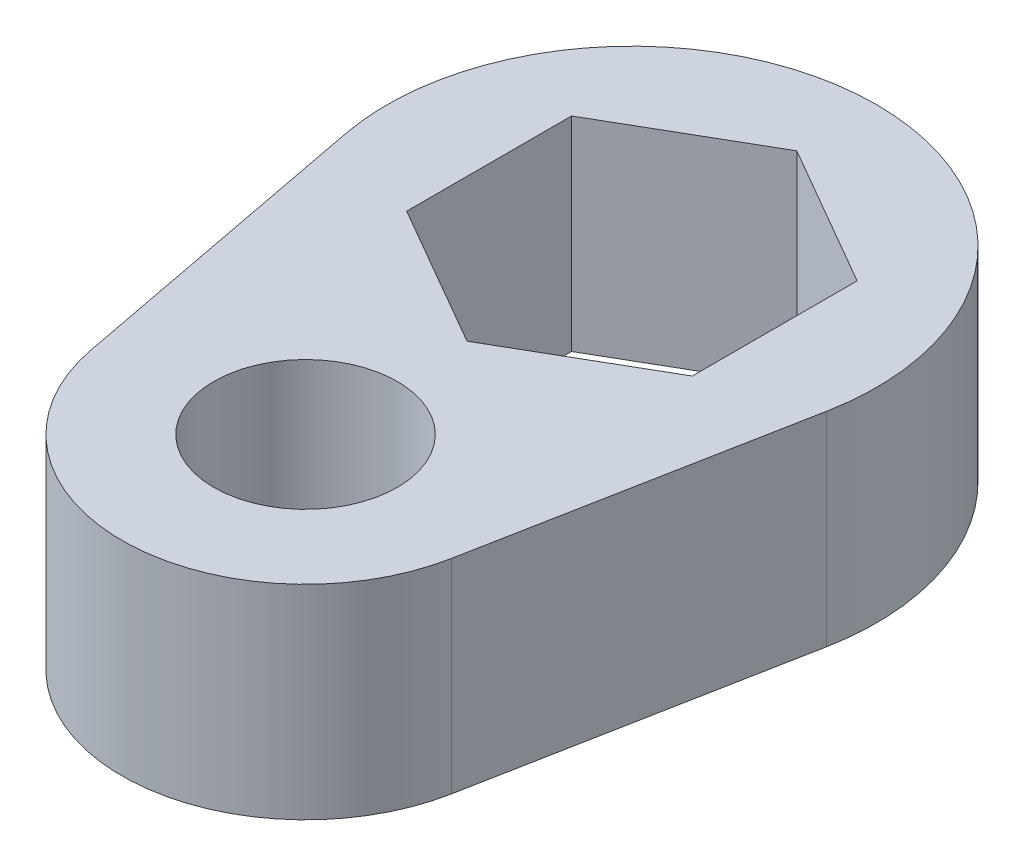
ISO-10303-21;
HEADER;
FILE_DESCRIPTION(('STEP AP214'),'2;1');
FILE_NAME('part.step','',(''),(''),'','','');
FILE_SCHEMA(('AUTOMOTIVE_DESIGN { 1 0 10303 214 1 1 1 1 }'));
ENDSEC;
DATA;
#1=APPLICATION_CONTEXT('core data for automotive mechanical design processes');
#2=APPLICATION_PROTOCOL_DEFINITION('international standard','automotive_design',2000,#1);
#3=PRODUCT_CONTEXT('',#1,'mechanical');
#4=PRODUCT('Part','Part','',(#3));
#5=PRODUCT_RELATED_PRODUCT_CATEGORY('part','',(#4));
#6=PRODUCT_DEFINITION_FORMATION('','',#4);
#7=PRODUCT_DEFINITION_CONTEXT('part definition',#1,'design');
#8=PRODUCT_DEFINITION('design','',#6,#7);
#9=PRODUCT_DEFINITION_SHAPE('','',#8);
#10=(LENGTH_UNIT() NAMED_UNIT(*) SI_UNIT(.MILLI.,.METRE.));
#11=(NAMED_UNIT(*) PLANE_ANGLE_UNIT() SI_UNIT($,.RADIAN.));
#12=(NAMED_UNIT(*) SI_UNIT($,.STERADIAN.) SOLID_ANGLE_UNIT());
#13=UNCERTAINTY_MEASURE_WITH_UNIT(LENGTH_MEASURE(1.E-05),#10,'distance_accuracy_value','');
#14=(GEOMETRIC_REPRESENTATION_CONTEXT(3) GLOBAL_UNCERTAINTY_ASSIGNED_CONTEXT((#13)) GLOBAL_UNIT_ASSIGNED_CONTEXT((#10,
#11,#12)) REPRESENTATION_CONTEXT('',''));
#15=CARTESIAN_POINT('',(0.,0.,0.));
#16=DIRECTION('',(0.,0.,1.));
#17=DIRECTION('',(1.,0.,0.));
#18=AXIS2_PLACEMENT_3D('',#15,#16,#17);
#19=CARTESIAN_POINT('',(0.,5.,0.));
#20=DIRECTION('',(0.,1.,0.));
#21=DIRECTION('',(0.,0.,1.));
#22=AXIS2_PLACEMENT_3D('',#19,#20,#21);
#23=PLANE('',#22);
#24=DIRECTION('',(-0.866025403784439,0.,0.499999999999999));
#25=VECTOR('',#24,1.);
#26=CARTESIAN_POINT('',(0.,5.,-4.04145188432738));
#27=LINE('',#26,#25);
#28=CARTESIAN_POINT('',(0.,5.,-4.04145188432738));
#29=VERTEX_POINT('',#28);
#30=CARTESIAN_POINT('',(-3.5,5.,-2.02072594216369));
#31=VERTEX_POINT('',#30);
#32=EDGE_CURVE('E119',#29,#31,#27,.T.);
#33=ORIENTED_EDGE('',*,*,#32,.F.);
#34=DIRECTION('',(-0.866025403784438,0.,-0.5));
#35=VECTOR('',#34,1.);
#36=CARTESIAN_POINT('',(3.5,5.,-2.02072594216369));
#37=LINE('',#36,#35);
#38=CARTESIAN_POINT('',(3.5,5.,-2.02072594216369));
#39=VERTEX_POINT('',#38);
#40=EDGE_CURVE('E111',#39,#29,#37,.T.);
#41=ORIENTED_EDGE('',*,*,#40,.F.);
#42=DIRECTION('',(0.,0.,-1.));
#43=VECTOR('',#42,1.);
#44=CARTESIAN_POINT('',(3.5,5.,2.02072594216369));
#45=LINE('',#44,#43);
#46=CARTESIAN_POINT('',(3.5,5.,2.02072594216369));
#47=VERTEX_POINT('',#46);
#48=EDGE_CURVE('E142',#47,#39,#45,.T.);
#49=ORIENTED_EDGE('',*,*,#48,.F.);
#50=DIRECTION('',(0.866025403784439,0.,-0.5));
#51=VECTOR('',#50,1.);
#52=CARTESIAN_POINT('',(0.,5.,4.04145188432738));
#53=LINE('',#52,#51);
#54=CARTESIAN_POINT('',(0.,5.,4.04145188432738));
#55=VERTEX_POINT('',#54);
#56=EDGE_CURVE('E140',#55,#47,#53,.T.);
#57=ORIENTED_EDGE('',*,*,#56,.F.);
#58=DIRECTION('',(0.866025403784438,0.,0.5));
#59=VECTOR('',#58,1.);
#60=CARTESIAN_POINT('',(-3.5,5.,2.02072594216369));
#61=LINE('',#60,#59);
#62=CARTESIAN_POINT('',(-3.5,5.,2.02072594216369));
#63=VERTEX_POINT('',#62);
#64=EDGE_CURVE('E135',#63,#55,#61,.T.);
#65=ORIENTED_EDGE('',*,*,#64,.F.);
#66=DIRECTION('',(0.,0.,1.));
#67=VECTOR('',#66,1.);
#68=CARTESIAN_POINT('',(-3.5,5.,-2.02072594216369));
#69=LINE('',#68,#67);
#70=EDGE_CURVE('E133',#31,#63,#69,.T.);
#71=ORIENTED_EDGE('',*,*,#70,.F.);
#72=EDGE_LOOP('',(#33,#41,#49,#57,#65,#71));
#73=FACE_BOUND('',#72,.T.);
#74=CARTESIAN_POINT('',(0.,5.,0.));
#75=DIRECTION('',(0.,1.,0.));
#76=DIRECTION('',(0.,0.,1.));
#77=AXIS2_PLACEMENT_3D('',#74,#75,#76);
#78=CIRCLE('',#77,6.);
#79=CARTESIAN_POINT('',(5.89358761706314,5.,1.125));
#80=VERTEX_POINT('',#79);
#81=CARTESIAN_POINT('',(-5.89358761706314,5.,1.125));
#82=VERTEX_POINT('',#81);
#83=EDGE_CURVE('E165',#80,#82,#78,.T.);
#84=ORIENTED_EDGE('',*,*,#83,.T.);
#85=DIRECTION('',(0.1875,0.,0.982264602843857));
#86=VECTOR('',#85,1.);
#87=CARTESIAN_POINT('',(-5.89358761706314,5.,1.125));
#88=LINE('',#87,#86);
#89=CARTESIAN_POINT('',(-4.42019071279736,5.,8.84375));
#90=VERTEX_POINT('',#89);
#91=EDGE_CURVE('E168',#82,#90,#88,.T.);
#92=ORIENTED_EDGE('',*,*,#91,.T.);
#93=CARTESIAN_POINT('',(0.,5.,8.));
#94=DIRECTION('',(0.,1.,0.));
#95=DIRECTION('',(0.,0.,1.));
#96=AXIS2_PLACEMENT_3D('',#93,#94,#95);
#97=CIRCLE('',#96,4.5);
#98=CARTESIAN_POINT('',(4.42019071279736,5.,8.84375));
#99=VERTEX_POINT('',#98);
#100=EDGE_CURVE('E171',#90,#99,#97,.T.);
#101=ORIENTED_EDGE('',*,*,#100,.T.);
#102=DIRECTION('',(0.1875,0.,-0.982264602843857));
#103=VECTOR('',#102,1.);
#104=CARTESIAN_POINT('',(5.89358761706314,5.,1.125));
#105=LINE('',#104,#103);
#106=EDGE_CURVE('E173',#99,#80,#105,.T.);
#107=ORIENTED_EDGE('',*,*,#106,.T.);
#108=EDGE_LOOP('',(#84,#92,#101,#107));
#109=FACE_BOUND('',#108,.T.);
#110=CARTESIAN_POINT('',(0.,5.,8.));
#111=DIRECTION('',(0.,1.,0.));
#112=DIRECTION('',(0.,0.,1.));
#113=AXIS2_PLACEMENT_3D('',#110,#111,#112);
#114=CIRCLE('',#113,2.25);
#115=CARTESIAN_POINT('',(0.,5.,10.25));
#116=VERTEX_POINT('',#115);
#117=EDGE_CURVE('E145',#116,#116,#114,.T.);
#118=ORIENTED_EDGE('',*,*,#117,.F.);
#119=EDGE_LOOP('',(#118));
#120=FACE_BOUND('',#119,.T.);
#121=ADVANCED_FACE('F34',(#73,#109,#120),#23,.T.);
#122=CARTESIAN_POINT('',(0.,0.,0.));
#123=DIRECTION('',(0.,1.,0.));
#124=DIRECTION('',(0.,0.,1.));
#125=AXIS2_PLACEMENT_3D('',#122,#123,#124);
#126=PLANE('',#125);
#127=DIRECTION('',(-0.866025403784438,0.,-0.5));
#128=VECTOR('',#127,1.);
#129=CARTESIAN_POINT('',(3.5,0.,-2.02072594216369));
#130=LINE('',#129,#128);
#131=CARTESIAN_POINT('',(3.5,0.,-2.02072594216369));
#132=VERTEX_POINT('',#131);
#133=CARTESIAN_POINT('',(0.,0.,-4.04145188432738));
#134=VERTEX_POINT('',#133);
#135=EDGE_CURVE('E57',#132,#134,#130,.T.);
#136=ORIENTED_EDGE('',*,*,#135,.T.);
#137=DIRECTION('',(-0.866025403784439,0.,0.499999999999999));
#138=VECTOR('',#137,1.);
#139=CARTESIAN_POINT('',(0.,0.,-4.04145188432738));
#140=LINE('',#139,#138);
#141=CARTESIAN_POINT('',(-3.5,0.,-2.02072594216369));
#142=VERTEX_POINT('',#141);
#143=EDGE_CURVE('E126',#134,#142,#140,.T.);
#144=ORIENTED_EDGE('',*,*,#143,.T.);
#145=DIRECTION('',(0.,0.,1.));
#146=VECTOR('',#145,1.);
#147=CARTESIAN_POINT('',(-3.5,0.,-2.02072594216369));
#148=LINE('',#147,#146);
#149=CARTESIAN_POINT('',(-3.5,0.,2.02072594216369));
#150=VERTEX_POINT('',#149);
#151=EDGE_CURVE('E147',#142,#150,#148,.T.);
#152=ORIENTED_EDGE('',*,*,#151,.T.);
#153=DIRECTION('',(0.866025403784438,0.,0.5));
#154=VECTOR('',#153,1.);
#155=CARTESIAN_POINT('',(-3.5,0.,2.02072594216369));
#156=LINE('',#155,#154);
#157=CARTESIAN_POINT('',(0.,0.,4.04145188432738));
#158=VERTEX_POINT('',#157);
#159=EDGE_CURVE('E150',#150,#158,#156,.T.);
#160=ORIENTED_EDGE('',*,*,#159,.T.);
#161=DIRECTION('',(0.866025403784439,0.,-0.5));
#162=VECTOR('',#161,1.);
#163=CARTESIAN_POINT('',(0.,0.,4.04145188432738));
#164=LINE('',#163,#162);
#165=CARTESIAN_POINT('',(3.5,0.,2.02072594216369));
#166=VERTEX_POINT('',#165);
#167=EDGE_CURVE('E153',#158,#166,#164,.T.);
#168=ORIENTED_EDGE('',*,*,#167,.T.);
#169=DIRECTION('',(0.,0.,-1.));
#170=VECTOR('',#169,1.);
#171=CARTESIAN_POINT('',(3.5,0.,2.02072594216369));
#172=LINE('',#171,#170);
#173=EDGE_CURVE('E120',#166,#132,#172,.T.);
#174=ORIENTED_EDGE('',*,*,#173,.T.);
#175=EDGE_LOOP('',(#136,#144,#152,#160,#168,#174));
#176=FACE_BOUND('',#175,.T.);
#177=CARTESIAN_POINT('',(0.,0.,0.));
#178=DIRECTION('',(0.,1.,0.));
#179=DIRECTION('',(0.,0.,1.));
#180=AXIS2_PLACEMENT_3D('',#177,#178,#179);
#181=CIRCLE('',#180,6.);
#182=CARTESIAN_POINT('',(5.89358761706314,0.,1.125));
#183=VERTEX_POINT('',#182);
#184=CARTESIAN_POINT('',(-5.89358761706314,0.,1.125));
#185=VERTEX_POINT('',#184);
#186=EDGE_CURVE('E127',#183,#185,#181,.T.);
#187=ORIENTED_EDGE('',*,*,#186,.F.);
#188=DIRECTION('',(0.1875,0.,-0.982264602843857));
#189=VECTOR('',#188,1.);
#190=CARTESIAN_POINT('',(5.89358761706314,0.,1.125));
#191=LINE('',#190,#189);
#192=CARTESIAN_POINT('',(4.42019071279736,0.,8.84375));
#193=VERTEX_POINT('',#192);
#194=EDGE_CURVE('E169',#193,#183,#191,.T.);
#195=ORIENTED_EDGE('',*,*,#194,.F.);
#196=CARTESIAN_POINT('',(0.,0.,8.));
#197=DIRECTION('',(0.,1.,0.));
#198=DIRECTION('',(0.,0.,1.));
#199=AXIS2_PLACEMENT_3D('',#196,#197,#198);
#200=CIRCLE('',#199,4.5);
#201=CARTESIAN_POINT('',(-4.42019071279736,0.,8.84375));
#202=VERTEX_POINT('',#201);
#203=EDGE_CURVE('E180',#202,#193,#200,.T.);
#204=ORIENTED_EDGE('',*,*,#203,.F.);
#205=DIRECTION('',(0.1875,0.,0.982264602843857));
#206=VECTOR('',#205,1.);
#207=CARTESIAN_POINT('',(-5.89358761706314,0.,1.125));
#208=LINE('',#207,#206);
#209=EDGE_CURVE('E178',#185,#202,#208,.T.);
#210=ORIENTED_EDGE('',*,*,#209,.F.);
#211=EDGE_LOOP('',(#187,#195,#204,#210));
#212=FACE_BOUND('',#211,.T.);
#213=CARTESIAN_POINT('',(0.,0.,8.));
#214=DIRECTION('',(0.,1.,0.));
#215=DIRECTION('',(0.,0.,1.));
#216=AXIS2_PLACEMENT_3D('',#213,#214,#215);
#217=CIRCLE('',#216,2.25);
#218=CARTESIAN_POINT('',(0.,0.,10.25));
#219=VERTEX_POINT('',#218);
#220=EDGE_CURVE('E260',#219,#219,#217,.T.);
#221=ORIENTED_EDGE('',*,*,#220,.T.);
#222=EDGE_LOOP('',(#221));
#223=FACE_BOUND('',#222,.T.);
#224=ADVANCED_FACE('F198',(#176,#212,#223),#126,.F.);
#225=CARTESIAN_POINT('',(0.,5.,0.));
#226=DIRECTION('',(0.,-1.,0.));
#227=DIRECTION('',(0.,0.,-1.));
#228=AXIS2_PLACEMENT_3D('',#225,#226,#227);
#229=CYLINDRICAL_SURFACE('',#228,6.);
#230=ORIENTED_EDGE('',*,*,#186,.T.);
#231=DIRECTION('',(0.,-1.,0.));
#232=VECTOR('',#231,1.);
#233=CARTESIAN_POINT('',(-5.89358761706314,5.,1.125));
#234=LINE('',#233,#232);
#235=EDGE_CURVE('E11',#82,#185,#234,.T.);
#236=ORIENTED_EDGE('',*,*,#235,.F.);
#237=ORIENTED_EDGE('',*,*,#83,.F.);
#238=DIRECTION('',(0.,-1.,0.));
#239=VECTOR('',#238,1.);
#240=CARTESIAN_POINT('',(5.89358761706314,5.,1.125));
#241=LINE('',#240,#239);
#242=EDGE_CURVE('E175',#80,#183,#241,.T.);
#243=ORIENTED_EDGE('',*,*,#242,.T.);
#244=EDGE_LOOP('',(#230,#236,#237,#243));
#245=FACE_BOUND('',#244,.T.);
#246=ADVANCED_FACE('F36',(#245),#229,.T.);
#247=CARTESIAN_POINT('',(-5.89358761706314,5.,1.125));
#248=DIRECTION('',(0.982264602843857,0.,-0.1875));
#249=DIRECTION('',(-0.1875,0.,-0.982264602843857));
#250=AXIS2_PLACEMENT_3D('',#247,#248,#249);
#251=PLANE('',#250);
#252=ORIENTED_EDGE('',*,*,#209,.T.);
#253=DIRECTION('',(0.,-1.,0.));
#254=VECTOR('',#253,1.);
#255=CARTESIAN_POINT('',(-4.42019071279736,5.,8.84375));
#256=LINE('',#255,#254);
#257=EDGE_CURVE('E42',#90,#202,#256,.T.);
#258=ORIENTED_EDGE('',*,*,#257,.F.);
#259=ORIENTED_EDGE('',*,*,#91,.F.);
#260=ORIENTED_EDGE('',*,*,#235,.T.);
#261=EDGE_LOOP('',(#252,#258,#259,#260));
#262=FACE_BOUND('',#261,.T.);
#263=ADVANCED_FACE('F208',(#262),#251,.F.);
#264=CARTESIAN_POINT('',(0.,5.,8.));
#265=DIRECTION('',(0.,-1.,0.));
#266=DIRECTION('',(0.,0.,-1.));
#267=AXIS2_PLACEMENT_3D('',#264,#265,#266);
#268=CYLINDRICAL_SURFACE('',#267,4.5);
#269=ORIENTED_EDGE('',*,*,#203,.T.);
#270=DIRECTION('',(0.,-1.,0.));
#271=VECTOR('',#270,1.);
#272=CARTESIAN_POINT('',(4.42019071279736,5.,8.84375));
#273=LINE('',#272,#271);
#274=EDGE_CURVE('E185',#99,#193,#273,.T.);
#275=ORIENTED_EDGE('',*,*,#274,.F.);
#276=ORIENTED_EDGE('',*,*,#100,.F.);
#277=ORIENTED_EDGE('',*,*,#257,.T.);
#278=EDGE_LOOP('',(#269,#275,#276,#277));
#279=FACE_BOUND('',#278,.T.);
#280=ADVANCED_FACE('F192',(#279),#268,.T.);
#281=CARTESIAN_POINT('',(5.89358761706314,5.,1.125));
#282=DIRECTION('',(-0.982264602843857,0.,-0.1875));
#283=DIRECTION('',(-0.1875,0.,0.982264602843857));
#284=AXIS2_PLACEMENT_3D('',#281,#282,#283);
#285=PLANE('',#284);
#286=ORIENTED_EDGE('',*,*,#194,.T.);
#287=ORIENTED_EDGE('',*,*,#242,.F.);
#288=ORIENTED_EDGE('',*,*,#106,.F.);
#289=ORIENTED_EDGE('',*,*,#274,.T.);
#290=EDGE_LOOP('',(#286,#287,#288,#289));
#291=FACE_BOUND('',#290,.T.);
#292=ADVANCED_FACE('F202',(#291),#285,.F.);
#293=CARTESIAN_POINT('',(3.5,5.,-2.02072594216369));
#294=DIRECTION('',(-0.5,0.,0.866025403784438));
#295=DIRECTION('',(0.866025403784438,0.,0.5));
#296=AXIS2_PLACEMENT_3D('',#293,#294,#295);
#297=PLANE('',#296);
#298=ORIENTED_EDGE('',*,*,#135,.F.);
#299=DIRECTION('',(0.,-1.,0.));
#300=VECTOR('',#299,1.);
#301=CARTESIAN_POINT('',(3.5,5.,-2.02072594216369));
#302=LINE('',#301,#300);
#303=EDGE_CURVE('E115',#39,#132,#302,.T.);
#304=ORIENTED_EDGE('',*,*,#303,.F.);
#305=ORIENTED_EDGE('',*,*,#40,.T.);
#306=DIRECTION('',(0.,-1.,0.));
#307=VECTOR('',#306,1.);
#308=CARTESIAN_POINT('',(0.,5.,-4.04145188432738));
#309=LINE('',#308,#307);
#310=EDGE_CURVE('E114',#29,#134,#309,.T.);
#311=ORIENTED_EDGE('',*,*,#310,.T.);
#312=EDGE_LOOP('',(#298,#304,#305,#311));
#313=FACE_BOUND('',#312,.T.);
#314=ADVANCED_FACE('F113',(#313),#297,.T.);
#315=CARTESIAN_POINT('',(0.,5.,-4.04145188432738));
#316=DIRECTION('',(0.499999999999999,0.,0.866025403784439));
#317=DIRECTION('',(0.866025403784439,0.,-0.499999999999999));
#318=AXIS2_PLACEMENT_3D('',#315,#316,#317);
#319=PLANE('',#318);
#320=ORIENTED_EDGE('',*,*,#143,.F.);
#321=ORIENTED_EDGE('',*,*,#310,.F.);
#322=ORIENTED_EDGE('',*,*,#32,.T.);
#323=DIRECTION('',(0.,-1.,0.));
#324=VECTOR('',#323,1.);
#325=CARTESIAN_POINT('',(-3.5,5.,-2.02072594216369));
#326=LINE('',#325,#324);
#327=EDGE_CURVE('E128',#31,#142,#326,.T.);
#328=ORIENTED_EDGE('',*,*,#327,.T.);
#329=EDGE_LOOP('',(#320,#321,#322,#328));
#330=FACE_BOUND('',#329,.T.);
#331=ADVANCED_FACE('F123',(#330),#319,.T.);
#332=CARTESIAN_POINT('',(-3.5,5.,-2.02072594216369));
#333=DIRECTION('',(1.,0.,0.));
#334=DIRECTION('',(0.,0.,-1.));
#335=AXIS2_PLACEMENT_3D('',#332,#333,#334);
#336=PLANE('',#335);
#337=ORIENTED_EDGE('',*,*,#151,.F.);
#338=ORIENTED_EDGE('',*,*,#327,.F.);
#339=ORIENTED_EDGE('',*,*,#70,.T.);
#340=DIRECTION('',(0.,-1.,0.));
#341=VECTOR('',#340,1.);
#342=CARTESIAN_POINT('',(-3.5,5.,2.02072594216369));
#343=LINE('',#342,#341);
#344=EDGE_CURVE('E162',#63,#150,#343,.T.);
#345=ORIENTED_EDGE('',*,*,#344,.T.);
#346=EDGE_LOOP('',(#337,#338,#339,#345));
#347=FACE_BOUND('',#346,.T.);
#348=ADVANCED_FACE('F232',(#347),#336,.T.);
#349=CARTESIAN_POINT('',(-3.5,5.,2.02072594216369));
#350=DIRECTION('',(0.5,0.,-0.866025403784438));
#351=DIRECTION('',(-0.866025403784439,0.,-0.5));
#352=AXIS2_PLACEMENT_3D('',#349,#350,#351);
#353=PLANE('',#352);
#354=ORIENTED_EDGE('',*,*,#159,.F.);
#355=ORIENTED_EDGE('',*,*,#344,.F.);
#356=ORIENTED_EDGE('',*,*,#64,.T.);
#357=DIRECTION('',(0.,-1.,0.));
#358=VECTOR('',#357,1.);
#359=CARTESIAN_POINT('',(0.,5.,4.04145188432738));
#360=LINE('',#359,#358);
#361=EDGE_CURVE('E160',#55,#158,#360,.T.);
#362=ORIENTED_EDGE('',*,*,#361,.T.);
#363=EDGE_LOOP('',(#354,#355,#356,#362));
#364=FACE_BOUND('',#363,.T.);
#365=ADVANCED_FACE('F236',(#364),#353,.T.);
#366=CARTESIAN_POINT('',(0.,5.,4.04145188432738));
#367=DIRECTION('',(-0.5,0.,-0.866025403784439));
#368=DIRECTION('',(-0.866025403784439,0.,0.5));
#369=AXIS2_PLACEMENT_3D('',#366,#367,#368);
#370=PLANE('',#369);
#371=ORIENTED_EDGE('',*,*,#167,.F.);
#372=ORIENTED_EDGE('',*,*,#361,.F.);
#373=ORIENTED_EDGE('',*,*,#56,.T.);
#374=DIRECTION('',(0.,-1.,0.));
#375=VECTOR('',#374,1.);
#376=CARTESIAN_POINT('',(3.5,5.,2.02072594216369));
#377=LINE('',#376,#375);
#378=EDGE_CURVE('E49',#47,#166,#377,.T.);
#379=ORIENTED_EDGE('',*,*,#378,.T.);
#380=EDGE_LOOP('',(#371,#372,#373,#379));
#381=FACE_BOUND('',#380,.T.);
#382=ADVANCED_FACE('F242',(#381),#370,.T.);
#383=CARTESIAN_POINT('',(3.5,5.,2.02072594216369));
#384=DIRECTION('',(-1.,0.,0.));
#385=DIRECTION('',(0.,0.,1.));
#386=AXIS2_PLACEMENT_3D('',#383,#384,#385);
#387=PLANE('',#386);
#388=ORIENTED_EDGE('',*,*,#173,.F.);
#389=ORIENTED_EDGE('',*,*,#378,.F.);
#390=ORIENTED_EDGE('',*,*,#48,.T.);
#391=ORIENTED_EDGE('',*,*,#303,.T.);
#392=EDGE_LOOP('',(#388,#389,#390,#391));
#393=FACE_BOUND('',#392,.T.);
#394=ADVANCED_FACE('F246',(#393),#387,.T.);
#395=CARTESIAN_POINT('',(0.,5.,8.));
#396=DIRECTION('',(0.,-1.,0.));
#397=DIRECTION('',(0.,0.,-1.));
#398=AXIS2_PLACEMENT_3D('',#395,#396,#397);
#399=CYLINDRICAL_SURFACE('',#398,2.25);
#400=ORIENTED_EDGE('',*,*,#117,.T.);
#401=EDGE_LOOP('',(#400));
#402=FACE_BOUND('',#401,.T.);
#403=ORIENTED_EDGE('',*,*,#220,.F.);
#404=EDGE_LOOP('',(#403));
#405=FACE_BOUND('',#404,.T.);
#406=ADVANCED_FACE('F250',(#402,#405),#399,.F.);
#407=CLOSED_SHELL('',(#121,#224,#246,#263,#280,#292,#314,#331,#348,#365,#382,#394,#406));
#408=MANIFOLD_SOLID_BREP('B2',#407);
#409=ADVANCED_BREP_SHAPE_REPRESENTATION('',(#18,#408),#14);
#410=SHAPE_DEFINITION_REPRESENTATION(#9,#409);
ENDSEC;
END-ISO-10303-21;
